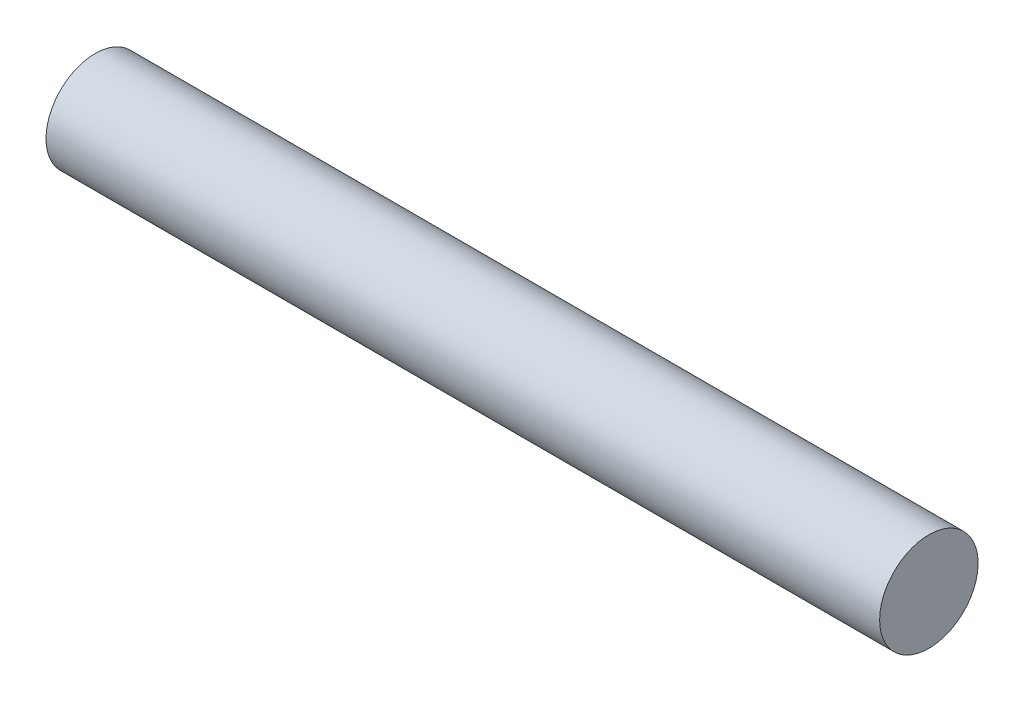
ISO-10303-21;
HEADER;
FILE_DESCRIPTION(('STEP AP214'),'2;1');
FILE_NAME('part.step','',(''),(''),'','','');
FILE_SCHEMA(('AUTOMOTIVE_DESIGN { 1 0 10303 214 1 1 1 1 }'));
ENDSEC;
DATA;
#1=APPLICATION_CONTEXT('core data for automotive mechanical design processes');
#2=APPLICATION_PROTOCOL_DEFINITION('international standard','automotive_design',2000,#1);
#3=PRODUCT_CONTEXT('',#1,'mechanical');
#4=PRODUCT('Part','Part','',(#3));
#5=PRODUCT_RELATED_PRODUCT_CATEGORY('part','',(#4));
#6=PRODUCT_DEFINITION_FORMATION('','',#4);
#7=PRODUCT_DEFINITION_CONTEXT('part definition',#1,'design');
#8=PRODUCT_DEFINITION('design','',#6,#7);
#9=PRODUCT_DEFINITION_SHAPE('','',#8);
#10=(LENGTH_UNIT() NAMED_UNIT(*) SI_UNIT(.MILLI.,.METRE.));
#11=(NAMED_UNIT(*) PLANE_ANGLE_UNIT() SI_UNIT($,.RADIAN.));
#12=(NAMED_UNIT(*) SI_UNIT($,.STERADIAN.) SOLID_ANGLE_UNIT());
#13=UNCERTAINTY_MEASURE_WITH_UNIT(LENGTH_MEASURE(1.E-05),#10,'distance_accuracy_value','');
#14=(GEOMETRIC_REPRESENTATION_CONTEXT(3) GLOBAL_UNCERTAINTY_ASSIGNED_CONTEXT((#13)) GLOBAL_UNIT_ASSIGNED_CONTEXT((#10,
#11,#12)) REPRESENTATION_CONTEXT('',''));
#15=CARTESIAN_POINT('',(0.,0.,0.));
#16=DIRECTION('',(0.,0.,1.));
#17=DIRECTION('',(1.,0.,0.));
#18=AXIS2_PLACEMENT_3D('',#15,#16,#17);
#19=CARTESIAN_POINT('',(12.7,0.,0.));
#20=DIRECTION('',(1.,0.,0.));
#21=DIRECTION('',(0.,0.,-1.));
#22=AXIS2_PLACEMENT_3D('',#19,#20,#21);
#23=PLANE('',#22);
#24=CARTESIAN_POINT('',(12.7,0.,0.));
#25=DIRECTION('',(-1.,0.,0.));
#26=DIRECTION('',(0.,0.,1.));
#27=AXIS2_PLACEMENT_3D('',#24,#25,#26);
#28=CIRCLE('',#27,1.5);
#29=CARTESIAN_POINT('',(12.7,0.,1.5));
#30=VERTEX_POINT('',#29);
#31=EDGE_CURVE('E18',#30,#30,#28,.T.);
#32=ORIENTED_EDGE('',*,*,#31,.F.);
#33=EDGE_LOOP('',(#32));
#34=FACE_BOUND('',#33,.T.);
#35=ADVANCED_FACE('F15',(#34),#23,.T.);
#36=CARTESIAN_POINT('',(-12.7,0.,0.));
#37=DIRECTION('',(1.,0.,0.));
#38=DIRECTION('',(0.,0.,-1.));
#39=AXIS2_PLACEMENT_3D('',#36,#37,#38);
#40=PLANE('',#39);
#41=CARTESIAN_POINT('',(-12.7,0.,0.));
#42=DIRECTION('',(-1.,0.,0.));
#43=DIRECTION('',(0.,0.,1.));
#44=AXIS2_PLACEMENT_3D('',#41,#42,#43);
#45=CIRCLE('',#44,1.5);
#46=CARTESIAN_POINT('',(-12.7,0.,1.5));
#47=VERTEX_POINT('',#46);
#48=EDGE_CURVE('E10',#47,#47,#45,.F.);
#49=ORIENTED_EDGE('',*,*,#48,.F.);
#50=EDGE_LOOP('',(#49));
#51=FACE_BOUND('',#50,.T.);
#52=ADVANCED_FACE('F30',(#51),#40,.F.);
#53=CARTESIAN_POINT('',(12.7,0.,0.));
#54=DIRECTION('',(-1.,0.,0.));
#55=DIRECTION('',(0.,0.,1.));
#56=AXIS2_PLACEMENT_3D('',#53,#54,#55);
#57=CYLINDRICAL_SURFACE('',#56,1.5);
#58=ORIENTED_EDGE('',*,*,#48,.T.);
#59=EDGE_LOOP('',(#58));
#60=FACE_BOUND('',#59,.T.);
#61=ORIENTED_EDGE('',*,*,#31,.T.);
#62=EDGE_LOOP('',(#61));
#63=FACE_BOUND('',#62,.T.);
#64=ADVANCED_FACE('F27',(#60,#63),#57,.T.);
#65=CLOSED_SHELL('',(#35,#52,#64));
#66=MANIFOLD_SOLID_BREP('B1',#65);
#67=ADVANCED_BREP_SHAPE_REPRESENTATION('',(#18,#66),#14);
#68=SHAPE_DEFINITION_REPRESENTATION(#9,#67);
ENDSEC;
END-ISO-10303-21;
